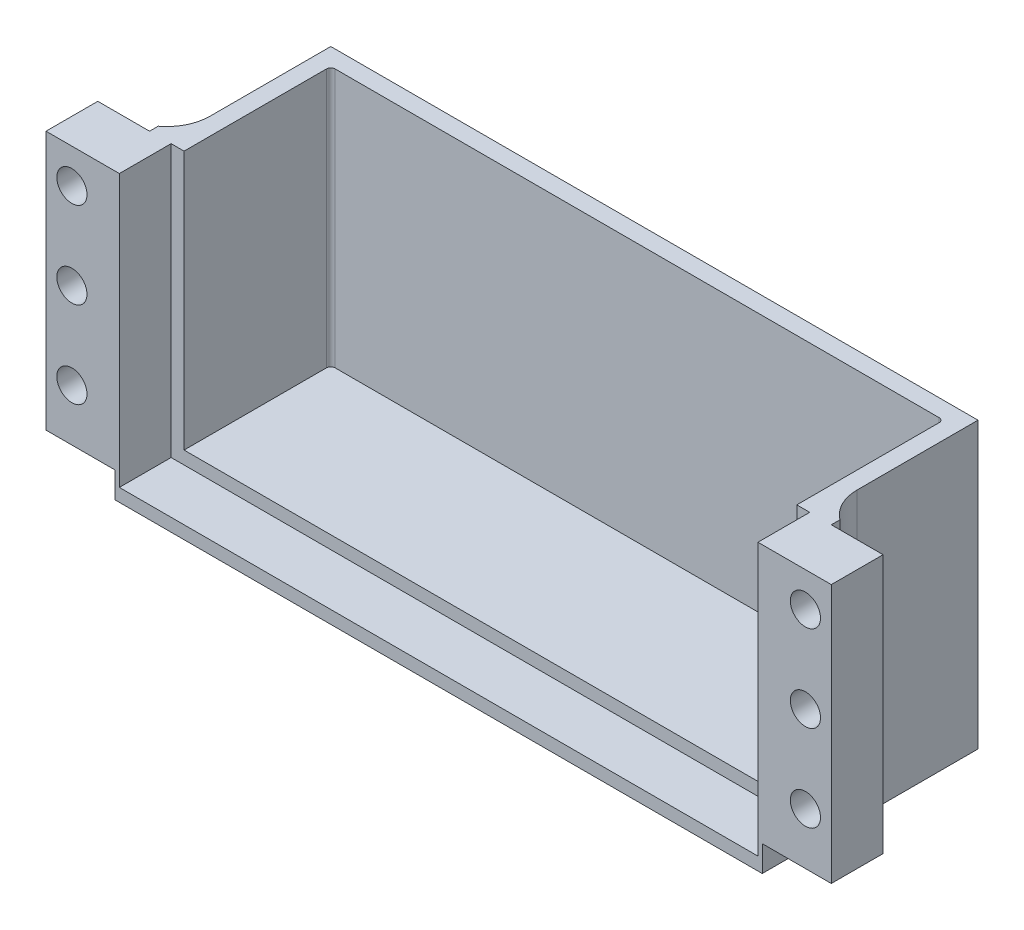
ISO-10303-21;
HEADER;
FILE_DESCRIPTION(('STEP AP214'),'2;1');
FILE_NAME('part.step','',(''),(''),'','','');
FILE_SCHEMA(('AUTOMOTIVE_DESIGN { 1 0 10303 214 1 1 1 1 }'));
ENDSEC;
DATA;
#1=APPLICATION_CONTEXT('core data for automotive mechanical design processes');
#2=APPLICATION_PROTOCOL_DEFINITION('international standard','automotive_design',2000,#1);
#3=PRODUCT_CONTEXT('',#1,'mechanical');
#4=PRODUCT('Part','Part','',(#3));
#5=PRODUCT_RELATED_PRODUCT_CATEGORY('part','',(#4));
#6=PRODUCT_DEFINITION_FORMATION('','',#4);
#7=PRODUCT_DEFINITION_CONTEXT('part definition',#1,'design');
#8=PRODUCT_DEFINITION('design','',#6,#7);
#9=PRODUCT_DEFINITION_SHAPE('','',#8);
#10=(LENGTH_UNIT() NAMED_UNIT(*) SI_UNIT(.MILLI.,.METRE.));
#11=(NAMED_UNIT(*) PLANE_ANGLE_UNIT() SI_UNIT($,.RADIAN.));
#12=(NAMED_UNIT(*) SI_UNIT($,.STERADIAN.) SOLID_ANGLE_UNIT());
#13=UNCERTAINTY_MEASURE_WITH_UNIT(LENGTH_MEASURE(1.E-05),#10,'distance_accuracy_value','');
#14=(GEOMETRIC_REPRESENTATION_CONTEXT(3) GLOBAL_UNCERTAINTY_ASSIGNED_CONTEXT((#13)) GLOBAL_UNIT_ASSIGNED_CONTEXT((#10,
#11,#12)) REPRESENTATION_CONTEXT('',''));
#15=CARTESIAN_POINT('',(0.,0.,0.));
#16=DIRECTION('',(0.,0.,1.));
#17=DIRECTION('',(1.,0.,0.));
#18=AXIS2_PLACEMENT_3D('',#15,#16,#17);
#19=CARTESIAN_POINT('',(0.,3.,0.));
#20=DIRECTION('',(0.,-1.,0.));
#21=DIRECTION('',(0.,0.,-1.));
#22=AXIS2_PLACEMENT_3D('',#19,#20,#21);
#23=PLANE('',#22);
#24=DIRECTION('',(1.,0.,0.));
#25=VECTOR('',#24,1.);
#26=CARTESIAN_POINT('',(-35.5,3.,-23.));
#27=LINE('',#26,#25);
#28=CARTESIAN_POINT('',(-35.,3.,-23.));
#29=VERTEX_POINT('',#28);
#30=CARTESIAN_POINT('',(35.,3.,-23.));
#31=VERTEX_POINT('',#30);
#32=EDGE_CURVE('E358',#29,#31,#27,.T.);
#33=ORIENTED_EDGE('',*,*,#32,.F.);
#34=CARTESIAN_POINT('',(-35.,3.,-22.5));
#35=DIRECTION('',(0.,-1.,0.));
#36=DIRECTION('',(0.,0.,-1.));
#37=AXIS2_PLACEMENT_3D('',#34,#35,#36);
#38=CIRCLE('',#37,0.5);
#39=CARTESIAN_POINT('',(-35.5,3.,-22.5));
#40=VERTEX_POINT('',#39);
#41=EDGE_CURVE('E423',#29,#40,#38,.F.);
#42=ORIENTED_EDGE('',*,*,#41,.T.);
#43=DIRECTION('',(0.,0.,-1.));
#44=VECTOR('',#43,1.);
#45=CARTESIAN_POINT('',(-35.5,3.,0.));
#46=LINE('',#45,#44);
#47=CARTESIAN_POINT('',(-35.5,3.,-6.));
#48=VERTEX_POINT('',#47);
#49=EDGE_CURVE('E216',#48,#40,#46,.T.);
#50=ORIENTED_EDGE('',*,*,#49,.F.);
#51=DIRECTION('',(-1.,0.,0.));
#52=VECTOR('',#51,1.);
#53=CARTESIAN_POINT('',(-35.5,3.,-6.));
#54=LINE('',#53,#52);
#55=CARTESIAN_POINT('',(35.5,3.,-6.));
#56=VERTEX_POINT('',#55);
#57=EDGE_CURVE('E266',#56,#48,#54,.T.);
#58=ORIENTED_EDGE('',*,*,#57,.F.);
#59=DIRECTION('',(0.,0.,1.));
#60=VECTOR('',#59,1.);
#61=CARTESIAN_POINT('',(35.5,3.,-23.));
#62=LINE('',#61,#60);
#63=CARTESIAN_POINT('',(35.5,3.,-22.5));
#64=VERTEX_POINT('',#63);
#65=EDGE_CURVE('E341',#64,#56,#62,.T.);
#66=ORIENTED_EDGE('',*,*,#65,.F.);
#67=CARTESIAN_POINT('',(35.,3.,-22.5));
#68=DIRECTION('',(0.,-1.,0.));
#69=DIRECTION('',(0.,0.,-1.));
#70=AXIS2_PLACEMENT_3D('',#67,#68,#69);
#71=CIRCLE('',#70,0.5);
#72=EDGE_CURVE('E421',#64,#31,#71,.F.);
#73=ORIENTED_EDGE('',*,*,#72,.T.);
#74=EDGE_LOOP('',(#33,#42,#50,#58,#66,#73));
#75=FACE_BOUND('',#74,.T.);
#76=ADVANCED_FACE('F45',(#75),#23,.F.);
#77=CARTESIAN_POINT('',(-35.5,33.,0.));
#78=DIRECTION('',(-1.,0.,0.));
#79=DIRECTION('',(0.,0.,1.));
#80=AXIS2_PLACEMENT_3D('',#77,#78,#79);
#81=PLANE('',#80);
#82=ORIENTED_EDGE('',*,*,#49,.T.);
#83=DIRECTION('',(0.,-1.,0.));
#84=VECTOR('',#83,1.);
#85=CARTESIAN_POINT('',(-35.5,33.,-22.5));
#86=LINE('',#85,#84);
#87=CARTESIAN_POINT('',(-35.5,33.,-22.5));
#88=VERTEX_POINT('',#87);
#89=EDGE_CURVE('E66',#40,#88,#86,.F.);
#90=ORIENTED_EDGE('',*,*,#89,.T.);
#91=DIRECTION('',(0.,0.,-1.));
#92=VECTOR('',#91,1.);
#93=CARTESIAN_POINT('',(-35.5,33.,0.));
#94=LINE('',#93,#92);
#95=CARTESIAN_POINT('',(-35.5,33.,-6.));
#96=VERTEX_POINT('',#95);
#97=EDGE_CURVE('E340',#96,#88,#94,.T.);
#98=ORIENTED_EDGE('',*,*,#97,.F.);
#99=DIRECTION('',(0.,1.,0.));
#100=VECTOR('',#99,1.);
#101=CARTESIAN_POINT('',(-35.5,33.,-6.));
#102=LINE('',#101,#100);
#103=EDGE_CURVE('E245',#48,#96,#102,.T.);
#104=ORIENTED_EDGE('',*,*,#103,.F.);
#105=EDGE_LOOP('',(#82,#90,#98,#104));
#106=FACE_BOUND('',#105,.T.);
#107=ADVANCED_FACE('F442',(#106),#81,.F.);
#108=CARTESIAN_POINT('',(35.5,33.,-23.));
#109=DIRECTION('',(1.,0.,0.));
#110=DIRECTION('',(0.,0.,-1.));
#111=AXIS2_PLACEMENT_3D('',#108,#109,#110);
#112=PLANE('',#111);
#113=DIRECTION('',(0.,0.,1.));
#114=VECTOR('',#113,1.);
#115=CARTESIAN_POINT('',(35.5,33.,-23.));
#116=LINE('',#115,#114);
#117=CARTESIAN_POINT('',(35.5,33.,-22.5));
#118=VERTEX_POINT('',#117);
#119=CARTESIAN_POINT('',(35.5,33.,-6.));
#120=VERTEX_POINT('',#119);
#121=EDGE_CURVE('E345',#118,#120,#116,.T.);
#122=ORIENTED_EDGE('',*,*,#121,.F.);
#123=DIRECTION('',(0.,-1.,0.));
#124=VECTOR('',#123,1.);
#125=CARTESIAN_POINT('',(35.5,3.,-22.5));
#126=LINE('',#125,#124);
#127=EDGE_CURVE('E426',#118,#64,#126,.T.);
#128=ORIENTED_EDGE('',*,*,#127,.T.);
#129=ORIENTED_EDGE('',*,*,#65,.T.);
#130=DIRECTION('',(0.,-1.,0.));
#131=VECTOR('',#130,1.);
#132=CARTESIAN_POINT('',(35.5,33.,-6.));
#133=LINE('',#132,#131);
#134=EDGE_CURVE('E263',#120,#56,#133,.T.);
#135=ORIENTED_EDGE('',*,*,#134,.F.);
#136=EDGE_LOOP('',(#122,#128,#129,#135));
#137=FACE_BOUND('',#136,.T.);
#138=ADVANCED_FACE('F464',(#137),#112,.F.);
#139=CARTESIAN_POINT('',(37.5,3.,0.));
#140=DIRECTION('',(-1.,0.,0.));
#141=DIRECTION('',(0.,0.,1.));
#142=AXIS2_PLACEMENT_3D('',#139,#140,#141);
#143=PLANE('',#142);
#144=DIRECTION('',(0.,0.,-1.));
#145=VECTOR('',#144,1.);
#146=CARTESIAN_POINT('',(37.5,33.,-25.));
#147=LINE('',#146,#145);
#148=CARTESIAN_POINT('',(37.5,33.,-11.));
#149=VERTEX_POINT('',#148);
#150=CARTESIAN_POINT('',(37.5,33.,-25.));
#151=VERTEX_POINT('',#150);
#152=EDGE_CURVE('E349',#149,#151,#147,.T.);
#153=ORIENTED_EDGE('',*,*,#152,.F.);
#154=DIRECTION('',(0.,1.,0.));
#155=VECTOR('',#154,1.);
#156=CARTESIAN_POINT('',(37.5,3.00000000000001,-11.));
#157=LINE('',#156,#155);
#158=CARTESIAN_POINT('',(37.5,3.00000000000001,-11.));
#159=VERTEX_POINT('',#158);
#160=EDGE_CURVE('E403',#149,#159,#157,.F.);
#161=ORIENTED_EDGE('',*,*,#160,.T.);
#162=DIRECTION('',(0.,0.,-1.));
#163=VECTOR('',#162,1.);
#164=CARTESIAN_POINT('',(37.5,3.00000000000001,0.));
#165=LINE('',#164,#163);
#166=CARTESIAN_POINT('',(37.5,3.00000000000001,0.));
#167=VERTEX_POINT('',#166);
#168=EDGE_CURVE('E306',#167,#159,#165,.T.);
#169=ORIENTED_EDGE('',*,*,#168,.F.);
#170=DIRECTION('',(0.,-1.,0.));
#171=VECTOR('',#170,1.);
#172=CARTESIAN_POINT('',(37.5,3.,0.));
#173=LINE('',#172,#171);
#174=CARTESIAN_POINT('',(37.5,0.,0.));
#175=VERTEX_POINT('',#174);
#176=EDGE_CURVE('E372',#167,#175,#173,.T.);
#177=ORIENTED_EDGE('',*,*,#176,.T.);
#178=DIRECTION('',(0.,0.,-1.));
#179=VECTOR('',#178,1.);
#180=CARTESIAN_POINT('',(37.5,0.,0.));
#181=LINE('',#180,#179);
#182=CARTESIAN_POINT('',(37.5,0.,-25.));
#183=VERTEX_POINT('',#182);
#184=EDGE_CURVE('E356',#175,#183,#181,.T.);
#185=ORIENTED_EDGE('',*,*,#184,.T.);
#186=DIRECTION('',(0.,-1.,0.));
#187=VECTOR('',#186,1.);
#188=CARTESIAN_POINT('',(37.5,3.,-25.));
#189=LINE('',#188,#187);
#190=EDGE_CURVE('E379',#151,#183,#189,.T.);
#191=ORIENTED_EDGE('',*,*,#190,.F.);
#192=EDGE_LOOP('',(#153,#161,#169,#177,#185,#191));
#193=FACE_BOUND('',#192,.T.);
#194=ADVANCED_FACE('F491',(#193),#143,.F.);
#195=CARTESIAN_POINT('',(-37.5,3.,0.));
#196=DIRECTION('',(1.,0.,0.));
#197=DIRECTION('',(0.,0.,-1.));
#198=AXIS2_PLACEMENT_3D('',#195,#196,#197);
#199=PLANE('',#198);
#200=DIRECTION('',(0.,0.,1.));
#201=VECTOR('',#200,1.);
#202=CARTESIAN_POINT('',(-37.5,3.,0.));
#203=LINE('',#202,#201);
#204=CARTESIAN_POINT('',(-37.5,3.,-11.));
#205=VERTEX_POINT('',#204);
#206=CARTESIAN_POINT('',(-37.5,3.,0.));
#207=VERTEX_POINT('',#206);
#208=EDGE_CURVE('E322',#205,#207,#203,.T.);
#209=ORIENTED_EDGE('',*,*,#208,.F.);
#210=DIRECTION('',(0.,-1.,0.));
#211=VECTOR('',#210,1.);
#212=CARTESIAN_POINT('',(-37.5,33.,-11.));
#213=LINE('',#212,#211);
#214=CARTESIAN_POINT('',(-37.5,33.,-11.));
#215=VERTEX_POINT('',#214);
#216=EDGE_CURVE('E382',#205,#215,#213,.F.);
#217=ORIENTED_EDGE('',*,*,#216,.T.);
#218=DIRECTION('',(0.,0.,1.));
#219=VECTOR('',#218,1.);
#220=CARTESIAN_POINT('',(-37.5,33.,0.));
#221=LINE('',#220,#219);
#222=CARTESIAN_POINT('',(-37.5,33.,-25.));
#223=VERTEX_POINT('',#222);
#224=EDGE_CURVE('E354',#223,#215,#221,.T.);
#225=ORIENTED_EDGE('',*,*,#224,.F.);
#226=DIRECTION('',(0.,-1.,0.));
#227=VECTOR('',#226,1.);
#228=CARTESIAN_POINT('',(-37.5,3.,-25.));
#229=LINE('',#228,#227);
#230=CARTESIAN_POINT('',(-37.5,0.,-25.));
#231=VERTEX_POINT('',#230);
#232=EDGE_CURVE('E376',#223,#231,#229,.T.);
#233=ORIENTED_EDGE('',*,*,#232,.T.);
#234=DIRECTION('',(0.,0.,1.));
#235=VECTOR('',#234,1.);
#236=CARTESIAN_POINT('',(-37.5,0.,0.));
#237=LINE('',#236,#235);
#238=CARTESIAN_POINT('',(-37.5,0.,0.));
#239=VERTEX_POINT('',#238);
#240=EDGE_CURVE('E366',#231,#239,#237,.T.);
#241=ORIENTED_EDGE('',*,*,#240,.T.);
#242=DIRECTION('',(0.,-1.,0.));
#243=VECTOR('',#242,1.);
#244=CARTESIAN_POINT('',(-37.5,3.,0.));
#245=LINE('',#244,#243);
#246=EDGE_CURVE('E374',#207,#239,#245,.T.);
#247=ORIENTED_EDGE('',*,*,#246,.F.);
#248=EDGE_LOOP('',(#209,#217,#225,#233,#241,#247));
#249=FACE_BOUND('',#248,.T.);
#250=ADVANCED_FACE('F488',(#249),#199,.F.);
#251=CARTESIAN_POINT('',(-37.5,3.,-25.));
#252=DIRECTION('',(0.,0.,1.));
#253=DIRECTION('',(1.,0.,0.));
#254=AXIS2_PLACEMENT_3D('',#251,#252,#253);
#255=PLANE('',#254);
#256=DIRECTION('',(-1.,0.,0.));
#257=VECTOR('',#256,1.);
#258=CARTESIAN_POINT('',(-37.5,0.,-25.));
#259=LINE('',#258,#257);
#260=EDGE_CURVE('E364',#183,#231,#259,.T.);
#261=ORIENTED_EDGE('',*,*,#260,.T.);
#262=ORIENTED_EDGE('',*,*,#232,.F.);
#263=DIRECTION('',(-1.,0.,0.));
#264=VECTOR('',#263,1.);
#265=CARTESIAN_POINT('',(-37.5,33.,-25.));
#266=LINE('',#265,#264);
#267=EDGE_CURVE('E351',#151,#223,#266,.T.);
#268=ORIENTED_EDGE('',*,*,#267,.F.);
#269=ORIENTED_EDGE('',*,*,#190,.T.);
#270=EDGE_LOOP('',(#261,#262,#268,#269));
#271=FACE_BOUND('',#270,.T.);
#272=ADVANCED_FACE('F486',(#271),#255,.F.);
#273=CARTESIAN_POINT('',(-37.5,3.,0.));
#274=DIRECTION('',(0.,0.,-1.));
#275=DIRECTION('',(-1.,0.,0.));
#276=AXIS2_PLACEMENT_3D('',#273,#274,#275);
#277=PLANE('',#276);
#278=CARTESIAN_POINT('',(42.5,19.,0.));
#279=DIRECTION('',(0.,0.,1.));
#280=DIRECTION('',(1.,0.,0.));
#281=AXIS2_PLACEMENT_3D('',#278,#279,#280);
#282=CIRCLE('',#281,1.75);
#283=CARTESIAN_POINT('',(44.25,19.,0.));
#284=VERTEX_POINT('',#283);
#285=EDGE_CURVE('E286',#284,#284,#282,.T.);
#286=ORIENTED_EDGE('',*,*,#285,.F.);
#287=EDGE_LOOP('',(#286));
#288=FACE_BOUND('',#287,.T.);
#289=CARTESIAN_POINT('',(-42.5,9.00000000000001,0.));
#290=DIRECTION('',(0.,0.,1.));
#291=DIRECTION('',(1.,0.,0.));
#292=AXIS2_PLACEMENT_3D('',#289,#290,#291);
#293=CIRCLE('',#292,1.75);
#294=CARTESIAN_POINT('',(-40.75,9.00000000000001,0.));
#295=VERTEX_POINT('',#294);
#296=EDGE_CURVE('E287',#295,#295,#293,.T.);
#297=ORIENTED_EDGE('',*,*,#296,.F.);
#298=EDGE_LOOP('',(#297));
#299=FACE_BOUND('',#298,.T.);
#300=CARTESIAN_POINT('',(-42.5,19.,0.));
#301=DIRECTION('',(0.,0.,1.));
#302=DIRECTION('',(1.,0.,0.));
#303=AXIS2_PLACEMENT_3D('',#300,#301,#302);
#304=CIRCLE('',#303,1.75);
#305=CARTESIAN_POINT('',(-40.75,19.,0.));
#306=VERTEX_POINT('',#305);
#307=EDGE_CURVE('E290',#306,#306,#304,.T.);
#308=ORIENTED_EDGE('',*,*,#307,.F.);
#309=EDGE_LOOP('',(#308));
#310=FACE_BOUND('',#309,.T.);
#311=CARTESIAN_POINT('',(42.5,29.,0.));
#312=DIRECTION('',(0.,0.,1.));
#313=DIRECTION('',(1.,0.,0.));
#314=AXIS2_PLACEMENT_3D('',#311,#312,#313);
#315=CIRCLE('',#314,1.75);
#316=CARTESIAN_POINT('',(44.25,29.,0.));
#317=VERTEX_POINT('',#316);
#318=EDGE_CURVE('E293',#317,#317,#315,.T.);
#319=ORIENTED_EDGE('',*,*,#318,.F.);
#320=EDGE_LOOP('',(#319));
#321=FACE_BOUND('',#320,.T.);
#322=CARTESIAN_POINT('',(42.5,9.00000000000001,0.));
#323=DIRECTION('',(0.,0.,1.));
#324=DIRECTION('',(1.,0.,0.));
#325=AXIS2_PLACEMENT_3D('',#322,#323,#324);
#326=CIRCLE('',#325,1.75);
#327=CARTESIAN_POINT('',(44.25,9.00000000000001,0.));
#328=VERTEX_POINT('',#327);
#329=EDGE_CURVE('E278',#328,#328,#326,.T.);
#330=ORIENTED_EDGE('',*,*,#329,.F.);
#331=EDGE_LOOP('',(#330));
#332=FACE_BOUND('',#331,.T.);
#333=CARTESIAN_POINT('',(-42.5,29.,0.));
#334=DIRECTION('',(0.,0.,1.));
#335=DIRECTION('',(1.,0.,0.));
#336=AXIS2_PLACEMENT_3D('',#333,#334,#335);
#337=CIRCLE('',#336,1.75);
#338=CARTESIAN_POINT('',(-40.75,29.,0.));
#339=VERTEX_POINT('',#338);
#340=EDGE_CURVE('E296',#339,#339,#337,.T.);
#341=ORIENTED_EDGE('',*,*,#340,.F.);
#342=EDGE_LOOP('',(#341));
#343=FACE_BOUND('',#342,.T.);
#344=DIRECTION('',(1.,0.,0.));
#345=VECTOR('',#344,1.);
#346=CARTESIAN_POINT('',(37.5,33.,0.));
#347=LINE('',#346,#345);
#348=CARTESIAN_POINT('',(37.,33.,0.));
#349=VERTEX_POINT('',#348);
#350=CARTESIAN_POINT('',(45.5,33.,0.));
#351=VERTEX_POINT('',#350);
#352=EDGE_CURVE('E347',#349,#351,#347,.T.);
#353=ORIENTED_EDGE('',*,*,#352,.F.);
#354=DIRECTION('',(0.,1.,0.));
#355=VECTOR('',#354,1.);
#356=CARTESIAN_POINT('',(37.,33.,0.));
#357=LINE('',#356,#355);
#358=CARTESIAN_POINT('',(37.,1.5,0.));
#359=VERTEX_POINT('',#358);
#360=EDGE_CURVE('E248',#359,#349,#357,.T.);
#361=ORIENTED_EDGE('',*,*,#360,.F.);
#362=DIRECTION('',(1.,0.,0.));
#363=VECTOR('',#362,1.);
#364=CARTESIAN_POINT('',(-37.,1.5,0.));
#365=LINE('',#364,#363);
#366=CARTESIAN_POINT('',(-37.,1.5,0.));
#367=VERTEX_POINT('',#366);
#368=EDGE_CURVE('E271',#367,#359,#365,.T.);
#369=ORIENTED_EDGE('',*,*,#368,.F.);
#370=DIRECTION('',(0.,-1.,0.));
#371=VECTOR('',#370,1.);
#372=CARTESIAN_POINT('',(-37.,33.,0.));
#373=LINE('',#372,#371);
#374=CARTESIAN_POINT('',(-37.,33.,0.));
#375=VERTEX_POINT('',#374);
#376=EDGE_CURVE('E244',#375,#367,#373,.T.);
#377=ORIENTED_EDGE('',*,*,#376,.F.);
#378=DIRECTION('',(1.,0.,0.));
#379=VECTOR('',#378,1.);
#380=CARTESIAN_POINT('',(-35.5,33.,0.));
#381=LINE('',#380,#379);
#382=CARTESIAN_POINT('',(-45.5,33.,0.));
#383=VERTEX_POINT('',#382);
#384=EDGE_CURVE('E337',#383,#375,#381,.T.);
#385=ORIENTED_EDGE('',*,*,#384,.F.);
#386=DIRECTION('',(0.,1.,0.));
#387=VECTOR('',#386,1.);
#388=CARTESIAN_POINT('',(-45.5,33.,0.));
#389=LINE('',#388,#387);
#390=CARTESIAN_POINT('',(-45.5,3.,0.));
#391=VERTEX_POINT('',#390);
#392=EDGE_CURVE('E323',#391,#383,#389,.T.);
#393=ORIENTED_EDGE('',*,*,#392,.F.);
#394=DIRECTION('',(1.,0.,0.));
#395=VECTOR('',#394,1.);
#396=CARTESIAN_POINT('',(-45.5,3.,0.));
#397=LINE('',#396,#395);
#398=EDGE_CURVE('E331',#391,#207,#397,.T.);
#399=ORIENTED_EDGE('',*,*,#398,.T.);
#400=ORIENTED_EDGE('',*,*,#246,.T.);
#401=DIRECTION('',(1.,0.,0.));
#402=VECTOR('',#401,1.);
#403=CARTESIAN_POINT('',(-37.5,0.,0.));
#404=LINE('',#403,#402);
#405=EDGE_CURVE('E369',#239,#175,#404,.T.);
#406=ORIENTED_EDGE('',*,*,#405,.T.);
#407=ORIENTED_EDGE('',*,*,#176,.F.);
#408=DIRECTION('',(-1.,0.,0.));
#409=VECTOR('',#408,1.);
#410=CARTESIAN_POINT('',(45.5,3.00000000000001,0.));
#411=LINE('',#410,#409);
#412=CARTESIAN_POINT('',(45.5,3.00000000000001,0.));
#413=VERTEX_POINT('',#412);
#414=EDGE_CURVE('E319',#413,#167,#411,.T.);
#415=ORIENTED_EDGE('',*,*,#414,.F.);
#416=DIRECTION('',(0.,-1.,0.));
#417=VECTOR('',#416,1.);
#418=CARTESIAN_POINT('',(45.5,33.,0.));
#419=LINE('',#418,#417);
#420=EDGE_CURVE('E302',#351,#413,#419,.T.);
#421=ORIENTED_EDGE('',*,*,#420,.F.);
#422=EDGE_LOOP('',(#353,#361,#369,#377,#385,#393,#399,#400,#406,#407,#415,#421));
#423=FACE_BOUND('',#422,.T.);
#424=ADVANCED_FACE('F452',(#288,#299,#310,#321,#332,#343,#423),#277,.F.);
#425=CARTESIAN_POINT('',(0.,0.,0.));
#426=DIRECTION('',(0.,-1.,0.));
#427=DIRECTION('',(0.,0.,-1.));
#428=AXIS2_PLACEMENT_3D('',#425,#426,#427);
#429=PLANE('',#428);
#430=ORIENTED_EDGE('',*,*,#184,.F.);
#431=ORIENTED_EDGE('',*,*,#405,.F.);
#432=ORIENTED_EDGE('',*,*,#240,.F.);
#433=ORIENTED_EDGE('',*,*,#260,.F.);
#434=EDGE_LOOP('',(#430,#431,#432,#433));
#435=FACE_BOUND('',#434,.T.);
#436=ADVANCED_FACE('F480',(#435),#429,.T.);
#437=CARTESIAN_POINT('',(-35.5,33.,-23.));
#438=DIRECTION('',(0.,0.,-1.));
#439=DIRECTION('',(-1.,0.,0.));
#440=AXIS2_PLACEMENT_3D('',#437,#438,#439);
#441=PLANE('',#440);
#442=DIRECTION('',(1.,0.,0.));
#443=VECTOR('',#442,1.);
#444=CARTESIAN_POINT('',(-35.5,33.,-23.));
#445=LINE('',#444,#443);
#446=CARTESIAN_POINT('',(-35.,33.,-23.));
#447=VERTEX_POINT('',#446);
#448=CARTESIAN_POINT('',(35.,33.,-23.));
#449=VERTEX_POINT('',#448);
#450=EDGE_CURVE('E343',#447,#449,#445,.T.);
#451=ORIENTED_EDGE('',*,*,#450,.F.);
#452=DIRECTION('',(0.,-1.,0.));
#453=VECTOR('',#452,1.);
#454=CARTESIAN_POINT('',(-35.,3.,-23.));
#455=LINE('',#454,#453);
#456=EDGE_CURVE('E418',#447,#29,#455,.T.);
#457=ORIENTED_EDGE('',*,*,#456,.T.);
#458=ORIENTED_EDGE('',*,*,#32,.T.);
#459=DIRECTION('',(0.,-1.,0.));
#460=VECTOR('',#459,1.);
#461=CARTESIAN_POINT('',(35.,33.,-23.));
#462=LINE('',#461,#460);
#463=EDGE_CURVE('E416',#31,#449,#462,.F.);
#464=ORIENTED_EDGE('',*,*,#463,.T.);
#465=EDGE_LOOP('',(#451,#457,#458,#464));
#466=FACE_BOUND('',#465,.T.);
#467=ADVANCED_FACE('F434',(#466),#441,.F.);
#468=CARTESIAN_POINT('',(0.,33.,0.));
#469=DIRECTION('',(0.,-1.,0.));
#470=DIRECTION('',(0.,0.,-1.));
#471=AXIS2_PLACEMENT_3D('',#468,#469,#470);
#472=PLANE('',#471);
#473=CARTESIAN_POINT('',(-42.5,33.,-11.));
#474=DIRECTION('',(0.,-1.,0.));
#475=DIRECTION('',(0.,0.,-1.));
#476=AXIS2_PLACEMENT_3D('',#473,#474,#475);
#477=CIRCLE('',#476,5.);
#478=CARTESIAN_POINT('',(-39.5,33.,-7.));
#479=VERTEX_POINT('',#478);
#480=EDGE_CURVE('E232',#215,#479,#477,.T.);
#481=ORIENTED_EDGE('',*,*,#480,.T.);
#482=DIRECTION('',(0.,0.,-1.));
#483=VECTOR('',#482,1.);
#484=CARTESIAN_POINT('',(-39.5,33.,-6.));
#485=LINE('',#484,#483);
#486=CARTESIAN_POINT('',(-39.5,33.,-6.));
#487=VERTEX_POINT('',#486);
#488=EDGE_CURVE('E222',#487,#479,#485,.T.);
#489=ORIENTED_EDGE('',*,*,#488,.F.);
#490=DIRECTION('',(1.,0.,0.));
#491=VECTOR('',#490,1.);
#492=CARTESIAN_POINT('',(-45.5,33.,-6.));
#493=LINE('',#492,#491);
#494=CARTESIAN_POINT('',(-45.5,33.,-6.));
#495=VERTEX_POINT('',#494);
#496=EDGE_CURVE('E208',#495,#487,#493,.T.);
#497=ORIENTED_EDGE('',*,*,#496,.F.);
#498=DIRECTION('',(0.,0.,-1.));
#499=VECTOR('',#498,1.);
#500=CARTESIAN_POINT('',(-45.5,33.,0.));
#501=LINE('',#500,#499);
#502=EDGE_CURVE('E326',#383,#495,#501,.T.);
#503=ORIENTED_EDGE('',*,*,#502,.F.);
#504=ORIENTED_EDGE('',*,*,#384,.T.);
#505=DIRECTION('',(0.,0.,1.));
#506=VECTOR('',#505,1.);
#507=CARTESIAN_POINT('',(-37.,33.,-6.));
#508=LINE('',#507,#506);
#509=CARTESIAN_POINT('',(-37.,33.,-6.));
#510=VERTEX_POINT('',#509);
#511=EDGE_CURVE('E268',#510,#375,#508,.T.);
#512=ORIENTED_EDGE('',*,*,#511,.F.);
#513=DIRECTION('',(-1.,0.,0.));
#514=VECTOR('',#513,1.);
#515=CARTESIAN_POINT('',(-35.5,33.,-6.));
#516=LINE('',#515,#514);
#517=EDGE_CURVE('E247',#96,#510,#516,.T.);
#518=ORIENTED_EDGE('',*,*,#517,.F.);
#519=ORIENTED_EDGE('',*,*,#97,.T.);
#520=CARTESIAN_POINT('',(-35.,33.,-22.5));
#521=DIRECTION('',(0.,-1.,0.));
#522=DIRECTION('',(0.,0.,-1.));
#523=AXIS2_PLACEMENT_3D('',#520,#521,#522);
#524=CIRCLE('',#523,0.5);
#525=EDGE_CURVE('E53',#88,#447,#524,.T.);
#526=ORIENTED_EDGE('',*,*,#525,.T.);
#527=ORIENTED_EDGE('',*,*,#450,.T.);
#528=CARTESIAN_POINT('',(35.,33.,-22.5));
#529=DIRECTION('',(0.,-1.,0.));
#530=DIRECTION('',(0.,0.,-1.));
#531=AXIS2_PLACEMENT_3D('',#528,#529,#530);
#532=CIRCLE('',#531,0.5);
#533=EDGE_CURVE('E11',#449,#118,#532,.T.);
#534=ORIENTED_EDGE('',*,*,#533,.T.);
#535=ORIENTED_EDGE('',*,*,#121,.T.);
#536=DIRECTION('',(-1.,0.,0.));
#537=VECTOR('',#536,1.);
#538=CARTESIAN_POINT('',(35.5,33.,-6.));
#539=LINE('',#538,#537);
#540=CARTESIAN_POINT('',(37.,33.,-6.));
#541=VERTEX_POINT('',#540);
#542=EDGE_CURVE('E260',#541,#120,#539,.T.);
#543=ORIENTED_EDGE('',*,*,#542,.F.);
#544=DIRECTION('',(0.,0.,1.));
#545=VECTOR('',#544,1.);
#546=CARTESIAN_POINT('',(37.,33.,-6.));
#547=LINE('',#546,#545);
#548=EDGE_CURVE('E275',#541,#349,#547,.T.);
#549=ORIENTED_EDGE('',*,*,#548,.T.);
#550=ORIENTED_EDGE('',*,*,#352,.T.);
#551=DIRECTION('',(0.,0.,1.));
#552=VECTOR('',#551,1.);
#553=CARTESIAN_POINT('',(45.5,33.,0.));
#554=LINE('',#553,#552);
#555=CARTESIAN_POINT('',(45.5,33.,-6.00000000000002));
#556=VERTEX_POINT('',#555);
#557=EDGE_CURVE('E310',#556,#351,#554,.T.);
#558=ORIENTED_EDGE('',*,*,#557,.F.);
#559=DIRECTION('',(-1.,0.,0.));
#560=VECTOR('',#559,1.);
#561=CARTESIAN_POINT('',(45.5,33.,-6.00000000000002));
#562=LINE('',#561,#560);
#563=CARTESIAN_POINT('',(39.5000000000001,33.,-6.00000000000028));
#564=VERTEX_POINT('',#563);
#565=EDGE_CURVE('E313',#556,#564,#562,.T.);
#566=ORIENTED_EDGE('',*,*,#565,.T.);
#567=DIRECTION('',(0.,0.,1.));
#568=VECTOR('',#567,1.);
#569=CARTESIAN_POINT('',(39.5000000000001,33.,-6.00000000000028));
#570=LINE('',#569,#568);
#571=CARTESIAN_POINT('',(39.5000000000001,33.,-6.99999999999994));
#572=VERTEX_POINT('',#571);
#573=EDGE_CURVE('E233',#572,#564,#570,.T.);
#574=ORIENTED_EDGE('',*,*,#573,.F.);
#575=CARTESIAN_POINT('',(42.5,33.,-11.));
#576=DIRECTION('',(0.,-1.,0.));
#577=DIRECTION('',(0.,0.,-1.));
#578=AXIS2_PLACEMENT_3D('',#575,#576,#577);
#579=CIRCLE('',#578,5.);
#580=EDGE_CURVE('E406',#572,#149,#579,.T.);
#581=ORIENTED_EDGE('',*,*,#580,.T.);
#582=ORIENTED_EDGE('',*,*,#152,.T.);
#583=ORIENTED_EDGE('',*,*,#267,.T.);
#584=ORIENTED_EDGE('',*,*,#224,.T.);
#585=EDGE_LOOP('',(#481,#489,#497,#503,#504,#512,#518,#519,#526,#527,#534,#535,#543,#549,#550,
#558,#566,#574,#581,#582,#583,#584));
#586=FACE_BOUND('',#585,.T.);
#587=ADVANCED_FACE('F229',(#586),#472,.F.);
#588=CARTESIAN_POINT('',(-45.5,33.,-6.));
#589=DIRECTION('',(0.,0.,1.));
#590=DIRECTION('',(0.,-1.,0.));
#591=AXIS2_PLACEMENT_3D('',#588,#589,#590);
#592=PLANE('',#591);
#593=CARTESIAN_POINT('',(-42.5,29.,-6.));
#594=DIRECTION('',(0.,0.,1.));
#595=DIRECTION('',(0.,-1.,0.));
#596=AXIS2_PLACEMENT_3D('',#593,#594,#595);
#597=CIRCLE('',#596,1.75);
#598=CARTESIAN_POINT('',(-42.5,27.25,-6.));
#599=VERTEX_POINT('',#598);
#600=EDGE_CURVE('E391',#599,#599,#597,.T.);
#601=ORIENTED_EDGE('',*,*,#600,.T.);
#602=EDGE_LOOP('',(#601));
#603=FACE_BOUND('',#602,.T.);
#604=CARTESIAN_POINT('',(-42.5,19.,-6.));
#605=DIRECTION('',(0.,0.,1.));
#606=DIRECTION('',(0.,-1.,0.));
#607=AXIS2_PLACEMENT_3D('',#604,#605,#606);
#608=CIRCLE('',#607,1.75);
#609=CARTESIAN_POINT('',(-42.5,17.25,-6.));
#610=VERTEX_POINT('',#609);
#611=EDGE_CURVE('E394',#610,#610,#608,.T.);
#612=ORIENTED_EDGE('',*,*,#611,.T.);
#613=EDGE_LOOP('',(#612));
#614=FACE_BOUND('',#613,.T.);
#615=CARTESIAN_POINT('',(-42.5,9.00000000000001,-6.));
#616=DIRECTION('',(0.,0.,1.));
#617=DIRECTION('',(0.,-1.,0.));
#618=AXIS2_PLACEMENT_3D('',#615,#616,#617);
#619=CIRCLE('',#618,1.75);
#620=CARTESIAN_POINT('',(-42.5,7.25,-6.));
#621=VERTEX_POINT('',#620);
#622=EDGE_CURVE('E315',#621,#621,#619,.T.);
#623=ORIENTED_EDGE('',*,*,#622,.T.);
#624=EDGE_LOOP('',(#623));
#625=FACE_BOUND('',#624,.T.);
#626=ORIENTED_EDGE('',*,*,#496,.T.);
#627=DIRECTION('',(0.,1.,0.));
#628=VECTOR('',#627,1.);
#629=CARTESIAN_POINT('',(-39.5,-3.,-6.));
#630=LINE('',#629,#628);
#631=CARTESIAN_POINT('',(-39.5,3.,-6.));
#632=VERTEX_POINT('',#631);
#633=EDGE_CURVE('E212',#632,#487,#630,.T.);
#634=ORIENTED_EDGE('',*,*,#633,.F.);
#635=DIRECTION('',(1.,0.,0.));
#636=VECTOR('',#635,1.);
#637=CARTESIAN_POINT('',(-45.5,3.,-6.));
#638=LINE('',#637,#636);
#639=CARTESIAN_POINT('',(-45.5,3.,-6.));
#640=VERTEX_POINT('',#639);
#641=EDGE_CURVE('E217',#640,#632,#638,.T.);
#642=ORIENTED_EDGE('',*,*,#641,.F.);
#643=DIRECTION('',(0.,-1.,0.));
#644=VECTOR('',#643,1.);
#645=CARTESIAN_POINT('',(-45.5,33.,-6.));
#646=LINE('',#645,#644);
#647=EDGE_CURVE('E213',#495,#640,#646,.T.);
#648=ORIENTED_EDGE('',*,*,#647,.F.);
#649=EDGE_LOOP('',(#626,#634,#642,#648));
#650=FACE_BOUND('',#649,.T.);
#651=ADVANCED_FACE('F210',(#603,#614,#625,#650),#592,.F.);
#652=CARTESIAN_POINT('',(-45.5,3.,0.));
#653=DIRECTION('',(0.,1.,0.));
#654=DIRECTION('',(0.,0.,1.));
#655=AXIS2_PLACEMENT_3D('',#652,#653,#654);
#656=PLANE('',#655);
#657=ORIENTED_EDGE('',*,*,#641,.T.);
#658=DIRECTION('',(0.,0.,-1.));
#659=VECTOR('',#658,1.);
#660=CARTESIAN_POINT('',(-39.5,3.,0.));
#661=LINE('',#660,#659);
#662=CARTESIAN_POINT('',(-39.5,3.,-6.99999999999999));
#663=VERTEX_POINT('',#662);
#664=EDGE_CURVE('E225',#632,#663,#661,.T.);
#665=ORIENTED_EDGE('',*,*,#664,.T.);
#666=CARTESIAN_POINT('',(-42.5,3.,-11.));
#667=DIRECTION('',(0.,1.,0.));
#668=DIRECTION('',(0.,0.,1.));
#669=AXIS2_PLACEMENT_3D('',#666,#667,#668);
#670=CIRCLE('',#669,5.);
#671=EDGE_CURVE('E400',#663,#205,#670,.T.);
#672=ORIENTED_EDGE('',*,*,#671,.T.);
#673=ORIENTED_EDGE('',*,*,#208,.T.);
#674=ORIENTED_EDGE('',*,*,#398,.F.);
#675=DIRECTION('',(0.,0.,1.));
#676=VECTOR('',#675,1.);
#677=CARTESIAN_POINT('',(-45.5,3.,0.));
#678=LINE('',#677,#676);
#679=EDGE_CURVE('E329',#640,#391,#678,.T.);
#680=ORIENTED_EDGE('',*,*,#679,.F.);
#681=EDGE_LOOP('',(#657,#665,#672,#673,#674,#680));
#682=FACE_BOUND('',#681,.T.);
#683=ADVANCED_FACE('F526',(#682),#656,.F.);
#684=CARTESIAN_POINT('',(-45.5,0.,0.));
#685=DIRECTION('',(1.,0.,0.));
#686=DIRECTION('',(0.,0.,-1.));
#687=AXIS2_PLACEMENT_3D('',#684,#685,#686);
#688=PLANE('',#687);
#689=ORIENTED_EDGE('',*,*,#392,.T.);
#690=ORIENTED_EDGE('',*,*,#502,.T.);
#691=ORIENTED_EDGE('',*,*,#647,.T.);
#692=ORIENTED_EDGE('',*,*,#679,.T.);
#693=EDGE_LOOP('',(#689,#690,#691,#692));
#694=FACE_BOUND('',#693,.T.);
#695=ADVANCED_FACE('F530',(#694),#688,.F.);
#696=CARTESIAN_POINT('',(45.5,3.00000000000001,0.));
#697=DIRECTION('',(0.,1.,0.));
#698=DIRECTION('',(0.,0.,1.));
#699=AXIS2_PLACEMENT_3D('',#696,#697,#698);
#700=PLANE('',#699);
#701=DIRECTION('',(0.,0.,1.));
#702=VECTOR('',#701,1.);
#703=CARTESIAN_POINT('',(39.5000000000002,3.00000000000001,0.));
#704=LINE('',#703,#702);
#705=CARTESIAN_POINT('',(39.5000000000001,3.00000000000001,-6.99999999999994));
#706=VERTEX_POINT('',#705);
#707=CARTESIAN_POINT('',(39.5000000000001,3.00000000000001,-6.00000000000028));
#708=VERTEX_POINT('',#707);
#709=EDGE_CURVE('E226',#706,#708,#704,.T.);
#710=ORIENTED_EDGE('',*,*,#709,.T.);
#711=DIRECTION('',(-1.,0.,0.));
#712=VECTOR('',#711,1.);
#713=CARTESIAN_POINT('',(45.5,3.00000000000001,-6.00000000000003));
#714=LINE('',#713,#712);
#715=CARTESIAN_POINT('',(45.5,3.00000000000001,-6.00000000000003));
#716=VERTEX_POINT('',#715);
#717=EDGE_CURVE('E317',#716,#708,#714,.T.);
#718=ORIENTED_EDGE('',*,*,#717,.F.);
#719=DIRECTION('',(0.,0.,-1.));
#720=VECTOR('',#719,1.);
#721=CARTESIAN_POINT('',(45.5,3.00000000000001,0.));
#722=LINE('',#721,#720);
#723=EDGE_CURVE('E305',#413,#716,#722,.T.);
#724=ORIENTED_EDGE('',*,*,#723,.F.);
#725=ORIENTED_EDGE('',*,*,#414,.T.);
#726=ORIENTED_EDGE('',*,*,#168,.T.);
#727=CARTESIAN_POINT('',(42.5,3.00000000000001,-11.));
#728=DIRECTION('',(0.,1.,0.));
#729=DIRECTION('',(0.,0.,1.));
#730=AXIS2_PLACEMENT_3D('',#727,#728,#729);
#731=CIRCLE('',#730,5.);
#732=EDGE_CURVE('E408',#159,#706,#731,.T.);
#733=ORIENTED_EDGE('',*,*,#732,.T.);
#734=EDGE_LOOP('',(#710,#718,#724,#725,#726,#733));
#735=FACE_BOUND('',#734,.T.);
#736=ADVANCED_FACE('F536',(#735),#700,.F.);
#737=CARTESIAN_POINT('',(45.5,33.,-6.00000000000002));
#738=DIRECTION('',(0.,0.,1.));
#739=DIRECTION('',(1.,0.,0.));
#740=AXIS2_PLACEMENT_3D('',#737,#738,#739);
#741=PLANE('',#740);
#742=CARTESIAN_POINT('',(42.5,9.00000000000001,-6.00000000000003));
#743=DIRECTION('',(0.,0.,1.));
#744=DIRECTION('',(1.,0.,0.));
#745=AXIS2_PLACEMENT_3D('',#742,#743,#744);
#746=CIRCLE('',#745,1.75);
#747=CARTESIAN_POINT('',(44.25,9.00000000000001,-6.00000000000003));
#748=VERTEX_POINT('',#747);
#749=EDGE_CURVE('E301',#748,#748,#746,.T.);
#750=ORIENTED_EDGE('',*,*,#749,.T.);
#751=EDGE_LOOP('',(#750));
#752=FACE_BOUND('',#751,.T.);
#753=CARTESIAN_POINT('',(42.5,19.,-6.00000000000002));
#754=DIRECTION('',(0.,0.,1.));
#755=DIRECTION('',(1.,0.,0.));
#756=AXIS2_PLACEMENT_3D('',#753,#754,#755);
#757=CIRCLE('',#756,1.75);
#758=CARTESIAN_POINT('',(44.25,19.,-6.00000000000002));
#759=VERTEX_POINT('',#758);
#760=EDGE_CURVE('E388',#759,#759,#757,.T.);
#761=ORIENTED_EDGE('',*,*,#760,.T.);
#762=EDGE_LOOP('',(#761));
#763=FACE_BOUND('',#762,.T.);
#764=CARTESIAN_POINT('',(42.5,29.,-6.00000000000002));
#765=DIRECTION('',(0.,0.,1.));
#766=DIRECTION('',(1.,0.,0.));
#767=AXIS2_PLACEMENT_3D('',#764,#765,#766);
#768=CIRCLE('',#767,1.75);
#769=CARTESIAN_POINT('',(44.25,29.,-6.00000000000002));
#770=VERTEX_POINT('',#769);
#771=EDGE_CURVE('E385',#770,#770,#768,.T.);
#772=ORIENTED_EDGE('',*,*,#771,.T.);
#773=EDGE_LOOP('',(#772));
#774=FACE_BOUND('',#773,.T.);
#775=ORIENTED_EDGE('',*,*,#717,.T.);
#776=DIRECTION('',(0.,1.,0.));
#777=VECTOR('',#776,1.);
#778=CARTESIAN_POINT('',(39.5000000000001,-3.,-6.00000000000028));
#779=LINE('',#778,#777);
#780=EDGE_CURVE('E236',#708,#564,#779,.T.);
#781=ORIENTED_EDGE('',*,*,#780,.T.);
#782=ORIENTED_EDGE('',*,*,#565,.F.);
#783=DIRECTION('',(0.,1.,0.));
#784=VECTOR('',#783,1.);
#785=CARTESIAN_POINT('',(45.5,33.,-6.00000000000002));
#786=LINE('',#785,#784);
#787=EDGE_CURVE('E308',#716,#556,#786,.T.);
#788=ORIENTED_EDGE('',*,*,#787,.F.);
#789=EDGE_LOOP('',(#775,#781,#782,#788));
#790=FACE_BOUND('',#789,.T.);
#791=ADVANCED_FACE('F545',(#752,#763,#774,#790),#741,.F.);
#792=CARTESIAN_POINT('',(45.5,0.,0.));
#793=DIRECTION('',(1.,0.,0.));
#794=DIRECTION('',(0.,0.,-1.));
#795=AXIS2_PLACEMENT_3D('',#792,#793,#794);
#796=PLANE('',#795);
#797=ORIENTED_EDGE('',*,*,#420,.T.);
#798=ORIENTED_EDGE('',*,*,#723,.T.);
#799=ORIENTED_EDGE('',*,*,#787,.T.);
#800=ORIENTED_EDGE('',*,*,#557,.T.);
#801=EDGE_LOOP('',(#797,#798,#799,#800));
#802=FACE_BOUND('',#801,.T.);
#803=ADVANCED_FACE('F540',(#802),#796,.T.);
#804=CARTESIAN_POINT('',(42.5,9.00000000000001,-8.));
#805=DIRECTION('',(0.,0.,1.));
#806=DIRECTION('',(1.,0.,0.));
#807=AXIS2_PLACEMENT_3D('',#804,#805,#806);
#808=CYLINDRICAL_SURFACE('',#807,1.75);
#809=ORIENTED_EDGE('',*,*,#329,.T.);
#810=EDGE_LOOP('',(#809));
#811=FACE_BOUND('',#810,.T.);
#812=ORIENTED_EDGE('',*,*,#749,.F.);
#813=EDGE_LOOP('',(#812));
#814=FACE_BOUND('',#813,.T.);
#815=ADVANCED_FACE('F554',(#811,#814),#808,.F.);
#816=CARTESIAN_POINT('',(42.5,29.,-8.));
#817=DIRECTION('',(0.,0.,1.));
#818=DIRECTION('',(1.,0.,0.));
#819=AXIS2_PLACEMENT_3D('',#816,#817,#818);
#820=CYLINDRICAL_SURFACE('',#819,1.75);
#821=ORIENTED_EDGE('',*,*,#318,.T.);
#822=EDGE_LOOP('',(#821));
#823=FACE_BOUND('',#822,.T.);
#824=ORIENTED_EDGE('',*,*,#771,.F.);
#825=EDGE_LOOP('',(#824));
#826=FACE_BOUND('',#825,.T.);
#827=ADVANCED_FACE('F718',(#823,#826),#820,.F.);
#828=CARTESIAN_POINT('',(42.5,19.,-8.));
#829=DIRECTION('',(0.,0.,1.));
#830=DIRECTION('',(1.,0.,0.));
#831=AXIS2_PLACEMENT_3D('',#828,#829,#830);
#832=CYLINDRICAL_SURFACE('',#831,1.75);
#833=ORIENTED_EDGE('',*,*,#285,.T.);
#834=EDGE_LOOP('',(#833));
#835=FACE_BOUND('',#834,.T.);
#836=ORIENTED_EDGE('',*,*,#760,.F.);
#837=EDGE_LOOP('',(#836));
#838=FACE_BOUND('',#837,.T.);
#839=ADVANCED_FACE('F709',(#835,#838),#832,.F.);
#840=CARTESIAN_POINT('',(-42.5,29.,-8.));
#841=DIRECTION('',(0.,0.,1.));
#842=DIRECTION('',(1.,0.,0.));
#843=AXIS2_PLACEMENT_3D('',#840,#841,#842);
#844=CYLINDRICAL_SURFACE('',#843,1.75);
#845=ORIENTED_EDGE('',*,*,#340,.T.);
#846=EDGE_LOOP('',(#845));
#847=FACE_BOUND('',#846,.T.);
#848=ORIENTED_EDGE('',*,*,#600,.F.);
#849=EDGE_LOOP('',(#848));
#850=FACE_BOUND('',#849,.T.);
#851=ADVANCED_FACE('F699',(#847,#850),#844,.F.);
#852=CARTESIAN_POINT('',(-42.5,19.,-8.));
#853=DIRECTION('',(0.,0.,1.));
#854=DIRECTION('',(1.,0.,0.));
#855=AXIS2_PLACEMENT_3D('',#852,#853,#854);
#856=CYLINDRICAL_SURFACE('',#855,1.75);
#857=ORIENTED_EDGE('',*,*,#307,.T.);
#858=EDGE_LOOP('',(#857));
#859=FACE_BOUND('',#858,.T.);
#860=ORIENTED_EDGE('',*,*,#611,.F.);
#861=EDGE_LOOP('',(#860));
#862=FACE_BOUND('',#861,.T.);
#863=ADVANCED_FACE('F689',(#859,#862),#856,.F.);
#864=CARTESIAN_POINT('',(-42.5,9.00000000000001,-8.));
#865=DIRECTION('',(0.,0.,1.));
#866=DIRECTION('',(1.,0.,0.));
#867=AXIS2_PLACEMENT_3D('',#864,#865,#866);
#868=CYLINDRICAL_SURFACE('',#867,1.75);
#869=ORIENTED_EDGE('',*,*,#296,.T.);
#870=EDGE_LOOP('',(#869));
#871=FACE_BOUND('',#870,.T.);
#872=ORIENTED_EDGE('',*,*,#622,.F.);
#873=EDGE_LOOP('',(#872));
#874=FACE_BOUND('',#873,.T.);
#875=ADVANCED_FACE('F667',(#871,#874),#868,.F.);
#876=CARTESIAN_POINT('',(37.,33.,-6.));
#877=DIRECTION('',(1.,0.,0.));
#878=DIRECTION('',(0.,0.,-1.));
#879=AXIS2_PLACEMENT_3D('',#876,#877,#878);
#880=PLANE('',#879);
#881=ORIENTED_EDGE('',*,*,#360,.T.);
#882=ORIENTED_EDGE('',*,*,#548,.F.);
#883=DIRECTION('',(0.,1.,0.));
#884=VECTOR('',#883,1.);
#885=CARTESIAN_POINT('',(37.,33.,-6.));
#886=LINE('',#885,#884);
#887=CARTESIAN_POINT('',(37.,1.5,-6.));
#888=VERTEX_POINT('',#887);
#889=EDGE_CURVE('E257',#888,#541,#886,.T.);
#890=ORIENTED_EDGE('',*,*,#889,.F.);
#891=DIRECTION('',(0.,0.,1.));
#892=VECTOR('',#891,1.);
#893=CARTESIAN_POINT('',(37.,1.5,-6.));
#894=LINE('',#893,#892);
#895=EDGE_CURVE('E279',#888,#359,#894,.T.);
#896=ORIENTED_EDGE('',*,*,#895,.T.);
#897=EDGE_LOOP('',(#881,#882,#890,#896));
#898=FACE_BOUND('',#897,.T.);
#899=ADVANCED_FACE('F659',(#898),#880,.F.);
#900=CARTESIAN_POINT('',(-37.,1.5,-6.));
#901=DIRECTION('',(0.,-1.,0.));
#902=DIRECTION('',(0.,0.,-1.));
#903=AXIS2_PLACEMENT_3D('',#900,#901,#902);
#904=PLANE('',#903);
#905=ORIENTED_EDGE('',*,*,#368,.T.);
#906=ORIENTED_EDGE('',*,*,#895,.F.);
#907=DIRECTION('',(1.,0.,0.));
#908=VECTOR('',#907,1.);
#909=CARTESIAN_POINT('',(-37.,1.5,-6.));
#910=LINE('',#909,#908);
#911=CARTESIAN_POINT('',(-37.,1.5,-6.));
#912=VERTEX_POINT('',#911);
#913=EDGE_CURVE('E254',#912,#888,#910,.T.);
#914=ORIENTED_EDGE('',*,*,#913,.F.);
#915=DIRECTION('',(0.,0.,1.));
#916=VECTOR('',#915,1.);
#917=CARTESIAN_POINT('',(-37.,1.5,-6.));
#918=LINE('',#917,#916);
#919=EDGE_CURVE('E281',#912,#367,#918,.T.);
#920=ORIENTED_EDGE('',*,*,#919,.T.);
#921=EDGE_LOOP('',(#905,#906,#914,#920));
#922=FACE_BOUND('',#921,.T.);
#923=ADVANCED_FACE('F456',(#922),#904,.F.);
#924=CARTESIAN_POINT('',(-37.,33.,-6.));
#925=DIRECTION('',(-1.,0.,0.));
#926=DIRECTION('',(0.,0.,1.));
#927=AXIS2_PLACEMENT_3D('',#924,#925,#926);
#928=PLANE('',#927);
#929=ORIENTED_EDGE('',*,*,#376,.T.);
#930=ORIENTED_EDGE('',*,*,#919,.F.);
#931=DIRECTION('',(0.,-1.,0.));
#932=VECTOR('',#931,1.);
#933=CARTESIAN_POINT('',(-37.,33.,-6.));
#934=LINE('',#933,#932);
#935=EDGE_CURVE('E251',#510,#912,#934,.T.);
#936=ORIENTED_EDGE('',*,*,#935,.F.);
#937=ORIENTED_EDGE('',*,*,#511,.T.);
#938=EDGE_LOOP('',(#929,#930,#936,#937));
#939=FACE_BOUND('',#938,.T.);
#940=ADVANCED_FACE('F448',(#939),#928,.F.);
#941=CARTESIAN_POINT('',(0.,0.,-6.));
#942=DIRECTION('',(0.,0.,1.));
#943=DIRECTION('',(1.,0.,0.));
#944=AXIS2_PLACEMENT_3D('',#941,#942,#943);
#945=PLANE('',#944);
#946=ORIENTED_EDGE('',*,*,#103,.T.);
#947=ORIENTED_EDGE('',*,*,#517,.T.);
#948=ORIENTED_EDGE('',*,*,#935,.T.);
#949=ORIENTED_EDGE('',*,*,#913,.T.);
#950=ORIENTED_EDGE('',*,*,#889,.T.);
#951=ORIENTED_EDGE('',*,*,#542,.T.);
#952=ORIENTED_EDGE('',*,*,#134,.T.);
#953=ORIENTED_EDGE('',*,*,#57,.T.);
#954=EDGE_LOOP('',(#946,#947,#948,#949,#950,#951,#952,#953));
#955=FACE_BOUND('',#954,.T.);
#956=ADVANCED_FACE('F444',(#955),#945,.T.);
#957=CARTESIAN_POINT('',(-42.5,33.,-11.));
#958=DIRECTION('',(0.,1.,0.));
#959=DIRECTION('',(0.,0.,1.));
#960=AXIS2_PLACEMENT_3D('',#957,#958,#959);
#961=CYLINDRICAL_SURFACE('',#960,5.);
#962=ORIENTED_EDGE('',*,*,#671,.F.);
#963=DIRECTION('',(0.,1.,0.));
#964=VECTOR('',#963,1.);
#965=CARTESIAN_POINT('',(-39.5,33.,-7.));
#966=LINE('',#965,#964);
#967=EDGE_CURVE('E414',#663,#479,#966,.T.);
#968=ORIENTED_EDGE('',*,*,#967,.T.);
#969=ORIENTED_EDGE('',*,*,#480,.F.);
#970=ORIENTED_EDGE('',*,*,#216,.F.);
#971=EDGE_LOOP('',(#962,#968,#969,#970));
#972=FACE_BOUND('',#971,.T.);
#973=ADVANCED_FACE('F499',(#972),#961,.F.);
#974=CARTESIAN_POINT('',(42.5,33.,-11.));
#975=DIRECTION('',(0.,-1.,0.));
#976=DIRECTION('',(0.,0.,-1.));
#977=AXIS2_PLACEMENT_3D('',#974,#975,#976);
#978=CYLINDRICAL_SURFACE('',#977,5.);
#979=ORIENTED_EDGE('',*,*,#580,.F.);
#980=DIRECTION('',(0.,-1.,0.));
#981=VECTOR('',#980,1.);
#982=CARTESIAN_POINT('',(39.5000000000001,33.,-6.99999999999994));
#983=LINE('',#982,#981);
#984=EDGE_CURVE('E411',#572,#706,#983,.T.);
#985=ORIENTED_EDGE('',*,*,#984,.T.);
#986=ORIENTED_EDGE('',*,*,#732,.F.);
#987=ORIENTED_EDGE('',*,*,#160,.F.);
#988=EDGE_LOOP('',(#979,#985,#986,#987));
#989=FACE_BOUND('',#988,.T.);
#990=ADVANCED_FACE('F502',(#989),#978,.F.);
#991=CARTESIAN_POINT('',(39.5000000000001,-3.,-6.00000000000028));
#992=DIRECTION('',(-1.,0.,0.));
#993=DIRECTION('',(0.,0.,1.));
#994=AXIS2_PLACEMENT_3D('',#991,#992,#993);
#995=PLANE('',#994);
#996=ORIENTED_EDGE('',*,*,#984,.F.);
#997=ORIENTED_EDGE('',*,*,#573,.T.);
#998=ORIENTED_EDGE('',*,*,#780,.F.);
#999=ORIENTED_EDGE('',*,*,#709,.F.);
#1000=EDGE_LOOP('',(#996,#997,#998,#999));
#1001=FACE_BOUND('',#1000,.T.);
#1002=ADVANCED_FACE('F505',(#1001),#995,.F.);
#1003=CARTESIAN_POINT('',(-39.5,-3.,-6.));
#1004=DIRECTION('',(1.,0.,0.));
#1005=DIRECTION('',(0.,0.,-1.));
#1006=AXIS2_PLACEMENT_3D('',#1003,#1004,#1005);
#1007=PLANE('',#1006);
#1008=ORIENTED_EDGE('',*,*,#633,.T.);
#1009=ORIENTED_EDGE('',*,*,#488,.T.);
#1010=ORIENTED_EDGE('',*,*,#967,.F.);
#1011=ORIENTED_EDGE('',*,*,#664,.F.);
#1012=EDGE_LOOP('',(#1008,#1009,#1010,#1011));
#1013=FACE_BOUND('',#1012,.T.);
#1014=ADVANCED_FACE('F221',(#1013),#1007,.F.);
#1015=CARTESIAN_POINT('',(-35.,33.,-22.5));
#1016=DIRECTION('',(0.,1.,0.));
#1017=DIRECTION('',(0.,0.,1.));
#1018=AXIS2_PLACEMENT_3D('',#1015,#1016,#1017);
#1019=CYLINDRICAL_SURFACE('',#1018,0.5);
#1020=ORIENTED_EDGE('',*,*,#525,.F.);
#1021=ORIENTED_EDGE('',*,*,#89,.F.);
#1022=ORIENTED_EDGE('',*,*,#41,.F.);
#1023=ORIENTED_EDGE('',*,*,#456,.F.);
#1024=EDGE_LOOP('',(#1020,#1021,#1022,#1023));
#1025=FACE_BOUND('',#1024,.T.);
#1026=ADVANCED_FACE('F437',(#1025),#1019,.F.);
#1027=CARTESIAN_POINT('',(35.,33.,-22.5));
#1028=DIRECTION('',(0.,1.,0.));
#1029=DIRECTION('',(0.,0.,1.));
#1030=AXIS2_PLACEMENT_3D('',#1027,#1028,#1029);
#1031=CYLINDRICAL_SURFACE('',#1030,0.5);
#1032=ORIENTED_EDGE('',*,*,#533,.F.);
#1033=ORIENTED_EDGE('',*,*,#463,.F.);
#1034=ORIENTED_EDGE('',*,*,#72,.F.);
#1035=ORIENTED_EDGE('',*,*,#127,.F.);
#1036=EDGE_LOOP('',(#1032,#1033,#1034,#1035));
#1037=FACE_BOUND('',#1036,.T.);
#1038=ADVANCED_FACE('F47',(#1037),#1031,.F.);
#1039=CLOSED_SHELL('',(#76,#107,#138,#194,#250,#272,#424,#436,#467,#587,#651,#683,#695,#736,
#791,#803,#815,#827,#839,#851,#863,#875,#899,#923,#940,#956,#973,#990,#1002,#1014,#1026,#1038));
#1040=MANIFOLD_SOLID_BREP('B2',#1039);
#1041=ADVANCED_BREP_SHAPE_REPRESENTATION('',(#18,#1040),#14);
#1042=SHAPE_DEFINITION_REPRESENTATION(#9,#1041);
ENDSEC;
END-ISO-10303-21;
